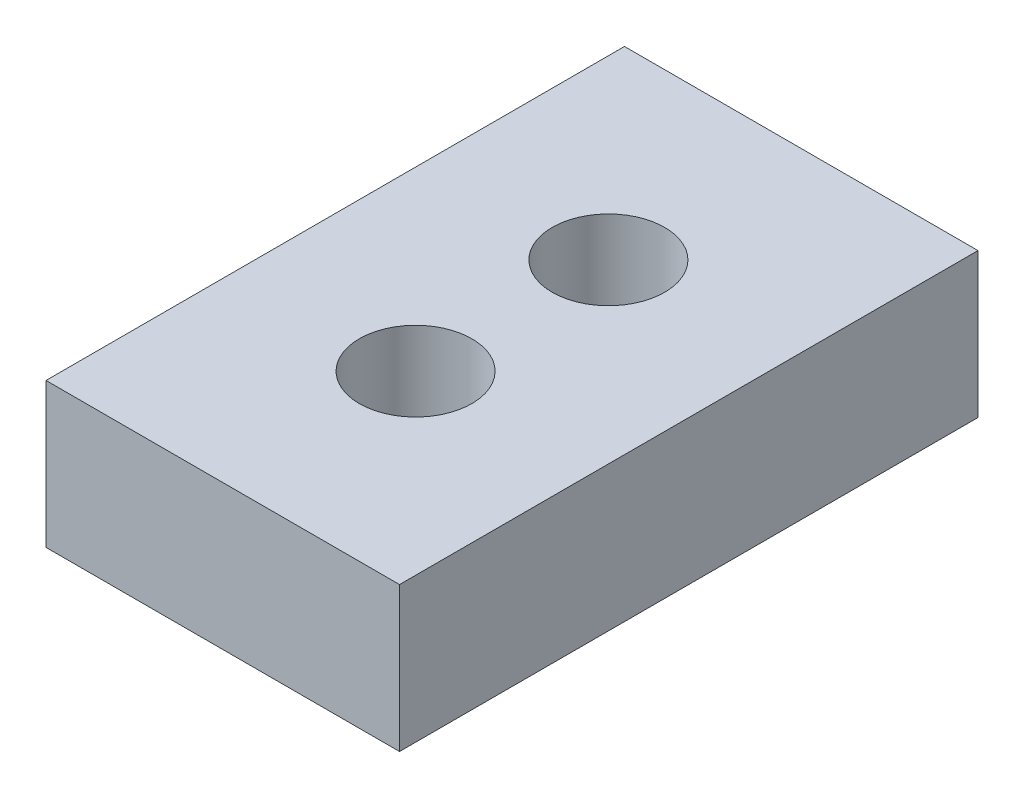
ISO-10303-21;
HEADER;
FILE_DESCRIPTION(('STEP AP214'),'2;1');
FILE_NAME('part.step','',(''),(''),'','','');
FILE_SCHEMA(('AUTOMOTIVE_DESIGN { 1 0 10303 214 1 1 1 1 }'));
ENDSEC;
DATA;
#1=APPLICATION_CONTEXT('core data for automotive mechanical design processes');
#2=APPLICATION_PROTOCOL_DEFINITION('international standard','automotive_design',2000,#1);
#3=PRODUCT_CONTEXT('',#1,'mechanical');
#4=PRODUCT('Part','Part','',(#3));
#5=PRODUCT_RELATED_PRODUCT_CATEGORY('part','',(#4));
#6=PRODUCT_DEFINITION_FORMATION('','',#4);
#7=PRODUCT_DEFINITION_CONTEXT('part definition',#1,'design');
#8=PRODUCT_DEFINITION('design','',#6,#7);
#9=PRODUCT_DEFINITION_SHAPE('','',#8);
#10=(LENGTH_UNIT() NAMED_UNIT(*) SI_UNIT(.MILLI.,.METRE.));
#11=(NAMED_UNIT(*) PLANE_ANGLE_UNIT() SI_UNIT($,.RADIAN.));
#12=(NAMED_UNIT(*) SI_UNIT($,.STERADIAN.) SOLID_ANGLE_UNIT());
#13=UNCERTAINTY_MEASURE_WITH_UNIT(LENGTH_MEASURE(1.E-05),#10,'distance_accuracy_value','');
#14=(GEOMETRIC_REPRESENTATION_CONTEXT(3) GLOBAL_UNCERTAINTY_ASSIGNED_CONTEXT((#13)) GLOBAL_UNIT_ASSIGNED_CONTEXT((#10,
#11,#12)) REPRESENTATION_CONTEXT('',''));
#15=CARTESIAN_POINT('',(0.,0.,0.));
#16=DIRECTION('',(0.,0.,1.));
#17=DIRECTION('',(1.,0.,0.));
#18=AXIS2_PLACEMENT_3D('',#15,#16,#17);
#19=CARTESIAN_POINT('',(-5.5,4.5,-9.));
#20=DIRECTION('',(0.,0.,1.));
#21=DIRECTION('',(1.,0.,0.));
#22=AXIS2_PLACEMENT_3D('',#19,#20,#21);
#23=PLANE('',#22);
#24=DIRECTION('',(-1.,0.,0.));
#25=VECTOR('',#24,1.);
#26=CARTESIAN_POINT('',(-5.5,0.,-9.));
#27=LINE('',#26,#25);
#28=CARTESIAN_POINT('',(5.5,0.,-9.));
#29=VERTEX_POINT('',#28);
#30=CARTESIAN_POINT('',(-5.5,0.,-9.));
#31=VERTEX_POINT('',#30);
#32=EDGE_CURVE('E107',#29,#31,#27,.T.);
#33=ORIENTED_EDGE('',*,*,#32,.T.);
#34=DIRECTION('',(0.,-1.,0.));
#35=VECTOR('',#34,1.);
#36=CARTESIAN_POINT('',(-5.5,4.5,-9.));
#37=LINE('',#36,#35);
#38=CARTESIAN_POINT('',(-5.5,4.5,-9.));
#39=VERTEX_POINT('',#38);
#40=EDGE_CURVE('E11',#39,#31,#37,.T.);
#41=ORIENTED_EDGE('',*,*,#40,.F.);
#42=DIRECTION('',(-1.,0.,0.));
#43=VECTOR('',#42,1.);
#44=CARTESIAN_POINT('',(-5.5,4.5,-9.));
#45=LINE('',#44,#43);
#46=CARTESIAN_POINT('',(5.5,4.5,-9.));
#47=VERTEX_POINT('',#46);
#48=EDGE_CURVE('E91',#47,#39,#45,.T.);
#49=ORIENTED_EDGE('',*,*,#48,.F.);
#50=DIRECTION('',(0.,-1.,0.));
#51=VECTOR('',#50,1.);
#52=CARTESIAN_POINT('',(5.5,4.5,-9.));
#53=LINE('',#52,#51);
#54=EDGE_CURVE('E103',#47,#29,#53,.T.);
#55=ORIENTED_EDGE('',*,*,#54,.T.);
#56=EDGE_LOOP('',(#33,#41,#49,#55));
#57=FACE_BOUND('',#56,.T.);
#58=ADVANCED_FACE('F39',(#57),#23,.F.);
#59=CARTESIAN_POINT('',(-5.5,4.5,-9.));
#60=DIRECTION('',(1.,0.,0.));
#61=DIRECTION('',(0.,0.,-1.));
#62=AXIS2_PLACEMENT_3D('',#59,#60,#61);
#63=PLANE('',#62);
#64=DIRECTION('',(0.,0.,1.));
#65=VECTOR('',#64,1.);
#66=CARTESIAN_POINT('',(-5.5,0.,-9.));
#67=LINE('',#66,#65);
#68=CARTESIAN_POINT('',(-5.5,0.,9.));
#69=VERTEX_POINT('',#68);
#70=EDGE_CURVE('E96',#31,#69,#67,.T.);
#71=ORIENTED_EDGE('',*,*,#70,.T.);
#72=DIRECTION('',(0.,-1.,0.));
#73=VECTOR('',#72,1.);
#74=CARTESIAN_POINT('',(-5.5,4.5,9.));
#75=LINE('',#74,#73);
#76=CARTESIAN_POINT('',(-5.5,4.5,9.));
#77=VERTEX_POINT('',#76);
#78=EDGE_CURVE('E48',#77,#69,#75,.T.);
#79=ORIENTED_EDGE('',*,*,#78,.F.);
#80=DIRECTION('',(0.,0.,1.));
#81=VECTOR('',#80,1.);
#82=CARTESIAN_POINT('',(-5.5,4.5,-9.));
#83=LINE('',#82,#81);
#84=EDGE_CURVE('E86',#39,#77,#83,.T.);
#85=ORIENTED_EDGE('',*,*,#84,.F.);
#86=ORIENTED_EDGE('',*,*,#40,.T.);
#87=EDGE_LOOP('',(#71,#79,#85,#86));
#88=FACE_BOUND('',#87,.T.);
#89=ADVANCED_FACE('F95',(#88),#63,.F.);
#90=CARTESIAN_POINT('',(-5.5,4.5,9.));
#91=DIRECTION('',(0.,0.,-1.));
#92=DIRECTION('',(-1.,0.,0.));
#93=AXIS2_PLACEMENT_3D('',#90,#91,#92);
#94=PLANE('',#93);
#95=DIRECTION('',(1.,0.,0.));
#96=VECTOR('',#95,1.);
#97=CARTESIAN_POINT('',(-5.5,0.,9.));
#98=LINE('',#97,#96);
#99=CARTESIAN_POINT('',(5.5,0.,9.));
#100=VERTEX_POINT('',#99);
#101=EDGE_CURVE('E73',#69,#100,#98,.T.);
#102=ORIENTED_EDGE('',*,*,#101,.T.);
#103=DIRECTION('',(0.,-1.,0.));
#104=VECTOR('',#103,1.);
#105=CARTESIAN_POINT('',(5.5,4.5,9.));
#106=LINE('',#105,#104);
#107=CARTESIAN_POINT('',(5.5,4.5,9.));
#108=VERTEX_POINT('',#107);
#109=EDGE_CURVE('E98',#108,#100,#106,.T.);
#110=ORIENTED_EDGE('',*,*,#109,.F.);
#111=DIRECTION('',(1.,0.,0.));
#112=VECTOR('',#111,1.);
#113=CARTESIAN_POINT('',(-5.5,4.5,9.));
#114=LINE('',#113,#112);
#115=EDGE_CURVE('E89',#77,#108,#114,.T.);
#116=ORIENTED_EDGE('',*,*,#115,.F.);
#117=ORIENTED_EDGE('',*,*,#78,.T.);
#118=EDGE_LOOP('',(#102,#110,#116,#117));
#119=FACE_BOUND('',#118,.T.);
#120=ADVANCED_FACE('F99',(#119),#94,.F.);
#121=CARTESIAN_POINT('',(5.5,4.5,-9.));
#122=DIRECTION('',(-1.,0.,0.));
#123=DIRECTION('',(0.,0.,1.));
#124=AXIS2_PLACEMENT_3D('',#121,#122,#123);
#125=PLANE('',#124);
#126=DIRECTION('',(0.,0.,-1.));
#127=VECTOR('',#126,1.);
#128=CARTESIAN_POINT('',(5.5,0.,-9.));
#129=LINE('',#128,#127);
#130=EDGE_CURVE('E79',#100,#29,#129,.T.);
#131=ORIENTED_EDGE('',*,*,#130,.T.);
#132=ORIENTED_EDGE('',*,*,#54,.F.);
#133=DIRECTION('',(0.,0.,-1.));
#134=VECTOR('',#133,1.);
#135=CARTESIAN_POINT('',(5.5,4.5,-9.));
#136=LINE('',#135,#134);
#137=EDGE_CURVE('E56',#108,#47,#136,.T.);
#138=ORIENTED_EDGE('',*,*,#137,.F.);
#139=ORIENTED_EDGE('',*,*,#109,.T.);
#140=EDGE_LOOP('',(#131,#132,#138,#139));
#141=FACE_BOUND('',#140,.T.);
#142=ADVANCED_FACE('F121',(#141),#125,.F.);
#143=CARTESIAN_POINT('',(0.,4.5,0.));
#144=DIRECTION('',(0.,-1.,0.));
#145=DIRECTION('',(0.,0.,-1.));
#146=AXIS2_PLACEMENT_3D('',#143,#144,#145);
#147=PLANE('',#146);
#148=CARTESIAN_POINT('',(0.,4.5,3.));
#149=DIRECTION('',(0.,1.,0.));
#150=DIRECTION('',(0.,0.,1.));
#151=AXIS2_PLACEMENT_3D('',#148,#149,#150);
#152=CIRCLE('',#151,1.75);
#153=CARTESIAN_POINT('',(0.,4.5,4.75));
#154=VERTEX_POINT('',#153);
#155=EDGE_CURVE('E136',#154,#154,#152,.T.);
#156=ORIENTED_EDGE('',*,*,#155,.F.);
#157=EDGE_LOOP('',(#156));
#158=FACE_BOUND('',#157,.T.);
#159=CARTESIAN_POINT('',(0.,4.5,-3.));
#160=DIRECTION('',(0.,1.,0.));
#161=DIRECTION('',(0.,0.,1.));
#162=AXIS2_PLACEMENT_3D('',#159,#160,#161);
#163=CIRCLE('',#162,1.75);
#164=CARTESIAN_POINT('',(0.,4.5,-1.25));
#165=VERTEX_POINT('',#164);
#166=EDGE_CURVE('E128',#165,#165,#163,.T.);
#167=ORIENTED_EDGE('',*,*,#166,.F.);
#168=EDGE_LOOP('',(#167));
#169=FACE_BOUND('',#168,.T.);
#170=ORIENTED_EDGE('',*,*,#48,.T.);
#171=ORIENTED_EDGE('',*,*,#84,.T.);
#172=ORIENTED_EDGE('',*,*,#115,.T.);
#173=ORIENTED_EDGE('',*,*,#137,.T.);
#174=EDGE_LOOP('',(#170,#171,#172,#173));
#175=FACE_BOUND('',#174,.T.);
#176=ADVANCED_FACE('F87',(#158,#169,#175),#147,.F.);
#177=CARTESIAN_POINT('',(0.,0.,0.));
#178=DIRECTION('',(0.,-1.,0.));
#179=DIRECTION('',(0.,0.,-1.));
#180=AXIS2_PLACEMENT_3D('',#177,#178,#179);
#181=PLANE('',#180);
#182=CARTESIAN_POINT('',(0.,0.,3.));
#183=DIRECTION('',(0.,1.,0.));
#184=DIRECTION('',(0.,0.,1.));
#185=AXIS2_PLACEMENT_3D('',#182,#183,#184);
#186=CIRCLE('',#185,1.75);
#187=CARTESIAN_POINT('',(0.,0.,4.75));
#188=VERTEX_POINT('',#187);
#189=EDGE_CURVE('E111',#188,#188,#186,.T.);
#190=ORIENTED_EDGE('',*,*,#189,.T.);
#191=EDGE_LOOP('',(#190));
#192=FACE_BOUND('',#191,.T.);
#193=CARTESIAN_POINT('',(0.,0.,-3.));
#194=DIRECTION('',(0.,1.,0.));
#195=DIRECTION('',(0.,0.,1.));
#196=AXIS2_PLACEMENT_3D('',#193,#194,#195);
#197=CIRCLE('',#196,1.75);
#198=CARTESIAN_POINT('',(0.,0.,-1.25));
#199=VERTEX_POINT('',#198);
#200=EDGE_CURVE('E132',#199,#199,#197,.T.);
#201=ORIENTED_EDGE('',*,*,#200,.T.);
#202=EDGE_LOOP('',(#201));
#203=FACE_BOUND('',#202,.T.);
#204=ORIENTED_EDGE('',*,*,#32,.F.);
#205=ORIENTED_EDGE('',*,*,#130,.F.);
#206=ORIENTED_EDGE('',*,*,#101,.F.);
#207=ORIENTED_EDGE('',*,*,#70,.F.);
#208=EDGE_LOOP('',(#204,#205,#206,#207));
#209=FACE_BOUND('',#208,.T.);
#210=ADVANCED_FACE('F124',(#192,#203,#209),#181,.T.);
#211=CARTESIAN_POINT('',(0.,0.,-3.));
#212=DIRECTION('',(0.,1.,0.));
#213=DIRECTION('',(0.,0.,1.));
#214=AXIS2_PLACEMENT_3D('',#211,#212,#213);
#215=CYLINDRICAL_SURFACE('',#214,1.75);
#216=ORIENTED_EDGE('',*,*,#200,.F.);
#217=EDGE_LOOP('',(#216));
#218=FACE_BOUND('',#217,.T.);
#219=ORIENTED_EDGE('',*,*,#166,.T.);
#220=EDGE_LOOP('',(#219));
#221=FACE_BOUND('',#220,.T.);
#222=ADVANCED_FACE('F149',(#218,#221),#215,.F.);
#223=CARTESIAN_POINT('',(0.,0.,3.));
#224=DIRECTION('',(0.,1.,0.));
#225=DIRECTION('',(0.,0.,1.));
#226=AXIS2_PLACEMENT_3D('',#223,#224,#225);
#227=CYLINDRICAL_SURFACE('',#226,1.75);
#228=ORIENTED_EDGE('',*,*,#189,.F.);
#229=EDGE_LOOP('',(#228));
#230=FACE_BOUND('',#229,.T.);
#231=ORIENTED_EDGE('',*,*,#155,.T.);
#232=EDGE_LOOP('',(#231));
#233=FACE_BOUND('',#232,.T.);
#234=ADVANCED_FACE('F146',(#230,#233),#227,.F.);
#235=CLOSED_SHELL('',(#58,#89,#120,#142,#176,#210,#222,#234));
#236=MANIFOLD_SOLID_BREP('B2',#235);
#237=ADVANCED_BREP_SHAPE_REPRESENTATION('',(#18,#236),#14);
#238=SHAPE_DEFINITION_REPRESENTATION(#9,#237);
ENDSEC;
END-ISO-10303-21;
